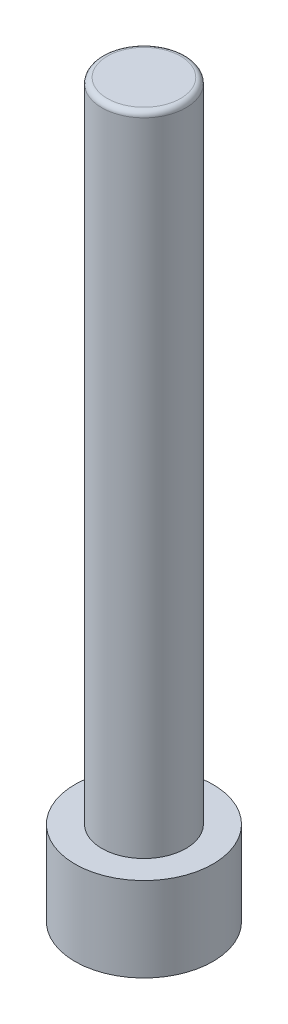
ISO-10303-21;
HEADER;
FILE_DESCRIPTION(('STEP AP214'),'2;1');
FILE_NAME('part.step','',(''),(''),'','','');
FILE_SCHEMA(('AUTOMOTIVE_DESIGN { 1 0 10303 214 1 1 1 1 }'));
ENDSEC;
DATA;
#1=APPLICATION_CONTEXT('core data for automotive mechanical design processes');
#2=APPLICATION_PROTOCOL_DEFINITION('international standard','automotive_design',2000,#1);
#3=PRODUCT_CONTEXT('',#1,'mechanical');
#4=PRODUCT('Part','Part','',(#3));
#5=PRODUCT_RELATED_PRODUCT_CATEGORY('part','',(#4));
#6=PRODUCT_DEFINITION_FORMATION('','',#4);
#7=PRODUCT_DEFINITION_CONTEXT('part definition',#1,'design');
#8=PRODUCT_DEFINITION('design','',#6,#7);
#9=PRODUCT_DEFINITION_SHAPE('','',#8);
#10=(LENGTH_UNIT() NAMED_UNIT(*) SI_UNIT(.MILLI.,.METRE.));
#11=(NAMED_UNIT(*) PLANE_ANGLE_UNIT() SI_UNIT($,.RADIAN.));
#12=(NAMED_UNIT(*) SI_UNIT($,.STERADIAN.) SOLID_ANGLE_UNIT());
#13=UNCERTAINTY_MEASURE_WITH_UNIT(LENGTH_MEASURE(1.E-05),#10,'distance_accuracy_value','');
#14=(GEOMETRIC_REPRESENTATION_CONTEXT(3) GLOBAL_UNCERTAINTY_ASSIGNED_CONTEXT((#13)) GLOBAL_UNIT_ASSIGNED_CONTEXT((#10,
#11,#12)) REPRESENTATION_CONTEXT('',''));
#15=CARTESIAN_POINT('',(0.,0.,0.));
#16=DIRECTION('',(0.,0.,1.));
#17=DIRECTION('',(1.,0.,0.));
#18=AXIS2_PLACEMENT_3D('',#15,#16,#17);
#19=CARTESIAN_POINT('',(0.,67.83,0.));
#20=DIRECTION('',(0.,-1.,0.));
#21=DIRECTION('',(0.,0.,-1.));
#22=AXIS2_PLACEMENT_3D('',#19,#20,#21);
#23=CYLINDRICAL_SURFACE('',#22,6.4);
#24=CARTESIAN_POINT('',(0.,0.,0.));
#25=DIRECTION('',(0.,1.,0.));
#26=DIRECTION('',(0.,0.,1.));
#27=AXIS2_PLACEMENT_3D('',#24,#25,#26);
#28=CIRCLE('',#27,6.4);
#29=CARTESIAN_POINT('',(0.,0.,6.4));
#30=VERTEX_POINT('',#29);
#31=EDGE_CURVE('E149',#30,#30,#28,.T.);
#32=ORIENTED_EDGE('',*,*,#31,.T.);
#33=EDGE_LOOP('',(#32));
#34=FACE_BOUND('',#33,.T.);
#35=CARTESIAN_POINT('',(0.,7.83,0.));
#36=DIRECTION('',(0.,1.,0.));
#37=DIRECTION('',(0.,0.,1.));
#38=AXIS2_PLACEMENT_3D('',#35,#36,#37);
#39=CIRCLE('',#38,6.4);
#40=CARTESIAN_POINT('',(0.,7.83,6.4));
#41=VERTEX_POINT('',#40);
#42=EDGE_CURVE('E148',#41,#41,#39,.T.);
#43=ORIENTED_EDGE('',*,*,#42,.F.);
#44=EDGE_LOOP('',(#43));
#45=FACE_BOUND('',#44,.T.);
#46=ADVANCED_FACE('F38',(#34,#45),#23,.T.);
#47=CARTESIAN_POINT('',(0.,0.,0.));
#48=DIRECTION('',(0.,1.,0.));
#49=DIRECTION('',(0.,0.,1.));
#50=AXIS2_PLACEMENT_3D('',#47,#48,#49);
#51=PLANE('',#50);
#52=DIRECTION('',(-0.5,0.,0.866025403784438));
#53=VECTOR('',#52,1.);
#54=CARTESIAN_POINT('',(3.46410161513775,0.,0.));
#55=LINE('',#54,#53);
#56=CARTESIAN_POINT('',(3.46410161513776,0.,0.));
#57=VERTEX_POINT('',#56);
#58=CARTESIAN_POINT('',(1.73205080756888,0.,3.));
#59=VERTEX_POINT('',#58);
#60=EDGE_CURVE('E127',#57,#59,#55,.T.);
#61=ORIENTED_EDGE('',*,*,#60,.F.);
#62=DIRECTION('',(0.5,0.,0.866025403784439));
#63=VECTOR('',#62,1.);
#64=CARTESIAN_POINT('',(1.73205080756888,0.,-3.));
#65=LINE('',#64,#63);
#66=CARTESIAN_POINT('',(1.73205080756888,0.,-3.));
#67=VERTEX_POINT('',#66);
#68=EDGE_CURVE('E53',#67,#57,#65,.T.);
#69=ORIENTED_EDGE('',*,*,#68,.F.);
#70=DIRECTION('',(1.,0.,0.));
#71=VECTOR('',#70,1.);
#72=CARTESIAN_POINT('',(-1.73205080756888,0.,-3.));
#73=LINE('',#72,#71);
#74=CARTESIAN_POINT('',(-1.73205080756888,0.,-3.));
#75=VERTEX_POINT('',#74);
#76=EDGE_CURVE('E136',#75,#67,#73,.T.);
#77=ORIENTED_EDGE('',*,*,#76,.F.);
#78=DIRECTION('',(0.5,0.,-0.866025403784439));
#79=VECTOR('',#78,1.);
#80=CARTESIAN_POINT('',(-3.46410161513775,0.,0.));
#81=LINE('',#80,#79);
#82=CARTESIAN_POINT('',(-3.46410161513775,0.,0.));
#83=VERTEX_POINT('',#82);
#84=EDGE_CURVE('E134',#83,#75,#81,.T.);
#85=ORIENTED_EDGE('',*,*,#84,.F.);
#86=DIRECTION('',(-0.5,0.,-0.866025403784439));
#87=VECTOR('',#86,1.);
#88=CARTESIAN_POINT('',(-1.73205080756888,0.,3.));
#89=LINE('',#88,#87);
#90=CARTESIAN_POINT('',(-1.73205080756888,0.,3.));
#91=VERTEX_POINT('',#90);
#92=EDGE_CURVE('E101',#91,#83,#89,.T.);
#93=ORIENTED_EDGE('',*,*,#92,.F.);
#94=DIRECTION('',(-1.,0.,0.));
#95=VECTOR('',#94,1.);
#96=CARTESIAN_POINT('',(1.73205080756888,0.,3.));
#97=LINE('',#96,#95);
#98=EDGE_CURVE('E130',#59,#91,#97,.T.);
#99=ORIENTED_EDGE('',*,*,#98,.F.);
#100=EDGE_LOOP('',(#61,#69,#77,#85,#93,#99));
#101=FACE_BOUND('',#100,.T.);
#102=ORIENTED_EDGE('',*,*,#31,.F.);
#103=EDGE_LOOP('',(#102));
#104=FACE_BOUND('',#103,.T.);
#105=ADVANCED_FACE('F167',(#101,#104),#51,.F.);
#106=CARTESIAN_POINT('',(0.,7.83,0.));
#107=DIRECTION('',(0.,1.,0.));
#108=DIRECTION('',(0.,0.,1.));
#109=AXIS2_PLACEMENT_3D('',#106,#107,#108);
#110=PLANE('',#109);
#111=CARTESIAN_POINT('',(0.,7.83,0.));
#112=DIRECTION('',(0.,1.,0.));
#113=DIRECTION('',(0.,0.,1.));
#114=AXIS2_PLACEMENT_3D('',#111,#112,#113);
#115=CIRCLE('',#114,3.9);
#116=CARTESIAN_POINT('',(0.,7.83,3.9));
#117=VERTEX_POINT('',#116);
#118=EDGE_CURVE('E140',#117,#117,#115,.T.);
#119=ORIENTED_EDGE('',*,*,#118,.F.);
#120=EDGE_LOOP('',(#119));
#121=FACE_BOUND('',#120,.T.);
#122=ORIENTED_EDGE('',*,*,#42,.T.);
#123=EDGE_LOOP('',(#122));
#124=FACE_BOUND('',#123,.T.);
#125=ADVANCED_FACE('F172',(#121,#124),#110,.T.);
#126=CARTESIAN_POINT('',(0.,7.83,0.));
#127=DIRECTION('',(0.,1.,0.));
#128=DIRECTION('',(0.,0.,1.));
#129=AXIS2_PLACEMENT_3D('',#126,#127,#128);
#130=CYLINDRICAL_SURFACE('',#129,3.9);
#131=CARTESIAN_POINT('',(0.,67.33,0.));
#132=DIRECTION('',(0.,1.,0.));
#133=DIRECTION('',(0.,0.,1.));
#134=AXIS2_PLACEMENT_3D('',#131,#132,#133);
#135=CIRCLE('',#134,3.9);
#136=CARTESIAN_POINT('',(0.,67.33,3.9));
#137=VERTEX_POINT('',#136);
#138=EDGE_CURVE('E12',#137,#137,#135,.F.);
#139=ORIENTED_EDGE('',*,*,#138,.T.);
#140=EDGE_LOOP('',(#139));
#141=FACE_BOUND('',#140,.T.);
#142=ORIENTED_EDGE('',*,*,#118,.T.);
#143=EDGE_LOOP('',(#142));
#144=FACE_BOUND('',#143,.T.);
#145=ADVANCED_FACE('F180',(#141,#144),#130,.T.);
#146=CARTESIAN_POINT('',(0.,67.83,0.));
#147=DIRECTION('',(0.,1.,0.));
#148=DIRECTION('',(0.,0.,1.));
#149=AXIS2_PLACEMENT_3D('',#146,#147,#148);
#150=PLANE('',#149);
#151=CARTESIAN_POINT('',(0.,67.83,0.));
#152=DIRECTION('',(0.,1.,0.));
#153=DIRECTION('',(0.,0.,1.));
#154=AXIS2_PLACEMENT_3D('',#151,#152,#153);
#155=CIRCLE('',#154,3.4);
#156=CARTESIAN_POINT('',(0.,67.83,3.4));
#157=VERTEX_POINT('',#156);
#158=EDGE_CURVE('E46',#157,#157,#155,.T.);
#159=ORIENTED_EDGE('',*,*,#158,.T.);
#160=EDGE_LOOP('',(#159));
#161=FACE_BOUND('',#160,.T.);
#162=ADVANCED_FACE('F156',(#161),#150,.T.);
#163=CARTESIAN_POINT('',(1.73205080756888,5.64,-3.));
#164=DIRECTION('',(0.866025403784439,0.,-0.5));
#165=DIRECTION('',(-0.5,0.,-0.866025403784439));
#166=AXIS2_PLACEMENT_3D('',#163,#164,#165);
#167=PLANE('',#166);
#168=ORIENTED_EDGE('',*,*,#68,.T.);
#169=DIRECTION('',(0.,-1.,0.));
#170=VECTOR('',#169,1.);
#171=CARTESIAN_POINT('',(3.46410161513775,5.64,0.));
#172=LINE('',#171,#170);
#173=CARTESIAN_POINT('',(3.46410161513775,5.64,0.));
#174=VERTEX_POINT('',#173);
#175=EDGE_CURVE('E83',#174,#57,#172,.T.);
#176=ORIENTED_EDGE('',*,*,#175,.F.);
#177=DIRECTION('',(0.5,0.,0.866025403784439));
#178=VECTOR('',#177,1.);
#179=CARTESIAN_POINT('',(1.73205080756888,5.64,-3.));
#180=LINE('',#179,#178);
#181=CARTESIAN_POINT('',(1.73205080756888,5.64,-3.));
#182=VERTEX_POINT('',#181);
#183=EDGE_CURVE('E138',#182,#174,#180,.T.);
#184=ORIENTED_EDGE('',*,*,#183,.F.);
#185=DIRECTION('',(0.,-1.,0.));
#186=VECTOR('',#185,1.);
#187=CARTESIAN_POINT('',(1.73205080756888,5.64,-3.));
#188=LINE('',#187,#186);
#189=EDGE_CURVE('E61',#182,#67,#188,.T.);
#190=ORIENTED_EDGE('',*,*,#189,.T.);
#191=EDGE_LOOP('',(#168,#176,#184,#190));
#192=FACE_BOUND('',#191,.T.);
#193=ADVANCED_FACE('F179',(#192),#167,.F.);
#194=CARTESIAN_POINT('',(-1.73205080756888,5.64,-3.));
#195=DIRECTION('',(0.,0.,-1.));
#196=DIRECTION('',(-1.,0.,0.));
#197=AXIS2_PLACEMENT_3D('',#194,#195,#196);
#198=PLANE('',#197);
#199=ORIENTED_EDGE('',*,*,#76,.T.);
#200=ORIENTED_EDGE('',*,*,#189,.F.);
#201=DIRECTION('',(1.,0.,0.));
#202=VECTOR('',#201,1.);
#203=CARTESIAN_POINT('',(-1.73205080756888,5.64,-3.));
#204=LINE('',#203,#202);
#205=CARTESIAN_POINT('',(-1.73205080756888,5.64,-3.));
#206=VERTEX_POINT('',#205);
#207=EDGE_CURVE('E113',#206,#182,#204,.T.);
#208=ORIENTED_EDGE('',*,*,#207,.F.);
#209=DIRECTION('',(0.,-1.,0.));
#210=VECTOR('',#209,1.);
#211=CARTESIAN_POINT('',(-1.73205080756888,5.64,-3.));
#212=LINE('',#211,#210);
#213=EDGE_CURVE('E105',#206,#75,#212,.T.);
#214=ORIENTED_EDGE('',*,*,#213,.T.);
#215=EDGE_LOOP('',(#199,#200,#208,#214));
#216=FACE_BOUND('',#215,.T.);
#217=ADVANCED_FACE('F189',(#216),#198,.F.);
#218=CARTESIAN_POINT('',(-3.46410161513775,5.64,0.));
#219=DIRECTION('',(-0.866025403784439,0.,-0.5));
#220=DIRECTION('',(-0.5,0.,0.866025403784439));
#221=AXIS2_PLACEMENT_3D('',#218,#219,#220);
#222=PLANE('',#221);
#223=ORIENTED_EDGE('',*,*,#84,.T.);
#224=ORIENTED_EDGE('',*,*,#213,.F.);
#225=DIRECTION('',(0.5,0.,-0.866025403784439));
#226=VECTOR('',#225,1.);
#227=CARTESIAN_POINT('',(-3.46410161513775,5.64,0.));
#228=LINE('',#227,#226);
#229=CARTESIAN_POINT('',(-3.46410161513775,5.64,0.));
#230=VERTEX_POINT('',#229);
#231=EDGE_CURVE('E109',#230,#206,#228,.T.);
#232=ORIENTED_EDGE('',*,*,#231,.F.);
#233=DIRECTION('',(0.,-1.,0.));
#234=VECTOR('',#233,1.);
#235=CARTESIAN_POINT('',(-3.46410161513775,5.64,0.));
#236=LINE('',#235,#234);
#237=EDGE_CURVE('E94',#230,#83,#236,.T.);
#238=ORIENTED_EDGE('',*,*,#237,.T.);
#239=EDGE_LOOP('',(#223,#224,#232,#238));
#240=FACE_BOUND('',#239,.T.);
#241=ADVANCED_FACE('F110',(#240),#222,.F.);
#242=CARTESIAN_POINT('',(-1.73205080756888,5.64,3.));
#243=DIRECTION('',(-0.866025403784439,0.,0.5));
#244=DIRECTION('',(0.5,0.,0.866025403784439));
#245=AXIS2_PLACEMENT_3D('',#242,#243,#244);
#246=PLANE('',#245);
#247=ORIENTED_EDGE('',*,*,#92,.T.);
#248=ORIENTED_EDGE('',*,*,#237,.F.);
#249=DIRECTION('',(-0.5,0.,-0.866025403784439));
#250=VECTOR('',#249,1.);
#251=CARTESIAN_POINT('',(-1.73205080756888,5.64,3.));
#252=LINE('',#251,#250);
#253=CARTESIAN_POINT('',(-1.73205080756888,5.64,3.));
#254=VERTEX_POINT('',#253);
#255=EDGE_CURVE('E98',#254,#230,#252,.T.);
#256=ORIENTED_EDGE('',*,*,#255,.F.);
#257=DIRECTION('',(0.,-1.,0.));
#258=VECTOR('',#257,1.);
#259=CARTESIAN_POINT('',(-1.73205080756888,5.64,3.));
#260=LINE('',#259,#258);
#261=EDGE_CURVE('E106',#254,#91,#260,.T.);
#262=ORIENTED_EDGE('',*,*,#261,.T.);
#263=EDGE_LOOP('',(#247,#248,#256,#262));
#264=FACE_BOUND('',#263,.T.);
#265=ADVANCED_FACE('F96',(#264),#246,.F.);
#266=CARTESIAN_POINT('',(1.73205080756888,5.64,3.));
#267=DIRECTION('',(0.,0.,1.));
#268=DIRECTION('',(1.,0.,0.));
#269=AXIS2_PLACEMENT_3D('',#266,#267,#268);
#270=PLANE('',#269);
#271=ORIENTED_EDGE('',*,*,#98,.T.);
#272=ORIENTED_EDGE('',*,*,#261,.F.);
#273=DIRECTION('',(-1.,0.,0.));
#274=VECTOR('',#273,1.);
#275=CARTESIAN_POINT('',(1.73205080756888,5.64,3.));
#276=LINE('',#275,#274);
#277=CARTESIAN_POINT('',(1.73205080756888,5.64,3.));
#278=VERTEX_POINT('',#277);
#279=EDGE_CURVE('E119',#278,#254,#276,.T.);
#280=ORIENTED_EDGE('',*,*,#279,.F.);
#281=DIRECTION('',(0.,-1.,0.));
#282=VECTOR('',#281,1.);
#283=CARTESIAN_POINT('',(1.73205080756888,5.64,3.));
#284=LINE('',#283,#282);
#285=EDGE_CURVE('E143',#278,#59,#284,.T.);
#286=ORIENTED_EDGE('',*,*,#285,.T.);
#287=EDGE_LOOP('',(#271,#272,#280,#286));
#288=FACE_BOUND('',#287,.T.);
#289=ADVANCED_FACE('F192',(#288),#270,.F.);
#290=CARTESIAN_POINT('',(3.46410161513775,5.64,0.));
#291=DIRECTION('',(0.866025403784439,0.,0.5));
#292=DIRECTION('',(0.5,0.,-0.866025403784439));
#293=AXIS2_PLACEMENT_3D('',#290,#291,#292);
#294=PLANE('',#293);
#295=ORIENTED_EDGE('',*,*,#60,.T.);
#296=ORIENTED_EDGE('',*,*,#285,.F.);
#297=DIRECTION('',(-0.5,0.,0.866025403784438));
#298=VECTOR('',#297,1.);
#299=CARTESIAN_POINT('',(3.46410161513775,5.64,0.));
#300=LINE('',#299,#298);
#301=EDGE_CURVE('E121',#174,#278,#300,.T.);
#302=ORIENTED_EDGE('',*,*,#301,.F.);
#303=ORIENTED_EDGE('',*,*,#175,.T.);
#304=EDGE_LOOP('',(#295,#296,#302,#303));
#305=FACE_BOUND('',#304,.T.);
#306=ADVANCED_FACE('F163',(#305),#294,.F.);
#307=CARTESIAN_POINT('',(0.,5.64,0.));
#308=DIRECTION('',(0.,-1.,0.));
#309=DIRECTION('',(0.,0.,-1.));
#310=AXIS2_PLACEMENT_3D('',#307,#308,#309);
#311=PLANE('',#310);
#312=ORIENTED_EDGE('',*,*,#183,.T.);
#313=ORIENTED_EDGE('',*,*,#301,.T.);
#314=ORIENTED_EDGE('',*,*,#279,.T.);
#315=ORIENTED_EDGE('',*,*,#255,.T.);
#316=ORIENTED_EDGE('',*,*,#231,.T.);
#317=ORIENTED_EDGE('',*,*,#207,.T.);
#318=EDGE_LOOP('',(#312,#313,#314,#315,#316,#317));
#319=FACE_BOUND('',#318,.T.);
#320=ADVANCED_FACE('F116',(#319),#311,.T.);
#321=CARTESIAN_POINT('',(0.,67.33,0.));
#322=DIRECTION('',(0.,1.,0.));
#323=DIRECTION('',(0.,0.,1.));
#324=AXIS2_PLACEMENT_3D('',#321,#322,#323);
#325=TOROIDAL_SURFACE('',#324,3.4,0.5);
#326=ORIENTED_EDGE('',*,*,#138,.F.);
#327=EDGE_LOOP('',(#326));
#328=FACE_BOUND('',#327,.T.);
#329=ORIENTED_EDGE('',*,*,#158,.F.);
#330=EDGE_LOOP('',(#329));
#331=FACE_BOUND('',#330,.T.);
#332=ADVANCED_FACE('F40',(#328,#331),#325,.T.);
#333=CLOSED_SHELL('',(#46,#105,#125,#145,#162,#193,#217,#241,#265,#289,#306,#320,#332));
#334=MANIFOLD_SOLID_BREP('B2',#333);
#335=ADVANCED_BREP_SHAPE_REPRESENTATION('',(#18,#334),#14);
#336=SHAPE_DEFINITION_REPRESENTATION(#9,#335);
ENDSEC;
END-ISO-10303-21;
